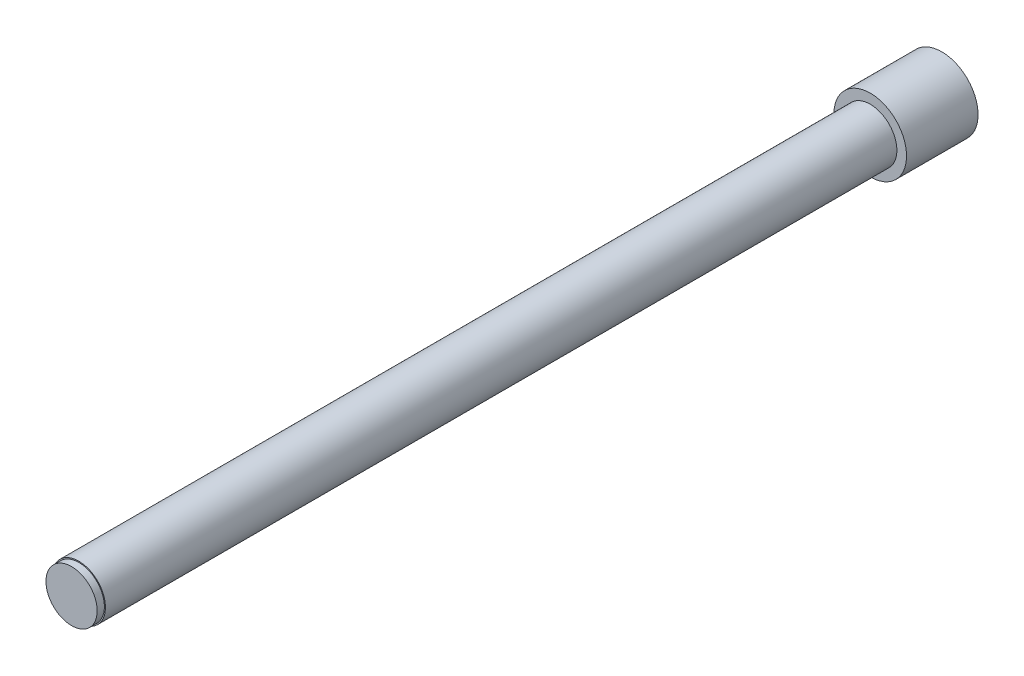
ISO-10303-21;
HEADER;
FILE_DESCRIPTION(('STEP AP214'),'2;1');
FILE_NAME('part.step','',(''),(''),'','','');
FILE_SCHEMA(('AUTOMOTIVE_DESIGN { 1 0 10303 214 1 1 1 1 }'));
ENDSEC;
DATA;
#1=APPLICATION_CONTEXT('core data for automotive mechanical design processes');
#2=APPLICATION_PROTOCOL_DEFINITION('international standard','automotive_design',2000,#1);
#3=PRODUCT_CONTEXT('',#1,'mechanical');
#4=PRODUCT('Part','Part','',(#3));
#5=PRODUCT_RELATED_PRODUCT_CATEGORY('part','',(#4));
#6=PRODUCT_DEFINITION_FORMATION('','',#4);
#7=PRODUCT_DEFINITION_CONTEXT('part definition',#1,'design');
#8=PRODUCT_DEFINITION('design','',#6,#7);
#9=PRODUCT_DEFINITION_SHAPE('','',#8);
#10=(LENGTH_UNIT() NAMED_UNIT(*) SI_UNIT(.MILLI.,.METRE.));
#11=(NAMED_UNIT(*) PLANE_ANGLE_UNIT() SI_UNIT($,.RADIAN.));
#12=(NAMED_UNIT(*) SI_UNIT($,.STERADIAN.) SOLID_ANGLE_UNIT());
#13=UNCERTAINTY_MEASURE_WITH_UNIT(LENGTH_MEASURE(1.E-05),#10,'distance_accuracy_value','');
#14=(GEOMETRIC_REPRESENTATION_CONTEXT(3) GLOBAL_UNCERTAINTY_ASSIGNED_CONTEXT((#13)) GLOBAL_UNIT_ASSIGNED_CONTEXT((#10,
#11,#12)) REPRESENTATION_CONTEXT('',''));
#15=CARTESIAN_POINT('',(0.,0.,0.));
#16=DIRECTION('',(0.,0.,1.));
#17=DIRECTION('',(1.,0.,0.));
#18=AXIS2_PLACEMENT_3D('',#15,#16,#17);
#19=CARTESIAN_POINT('',(0.,0.,40.767));
#20=DIRECTION('',(0.,0.,-1.));
#21=DIRECTION('',(-1.,0.,0.));
#22=AXIS2_PLACEMENT_3D('',#19,#20,#21);
#23=CYLINDRICAL_SURFACE('',#22,2.5);
#24=CARTESIAN_POINT('',(0.,0.,40.0911439523214));
#25=DIRECTION('',(0.,0.,1.));
#26=DIRECTION('',(1.,0.,0.));
#27=AXIS2_PLACEMENT_3D('',#24,#25,#26);
#28=CIRCLE('',#27,2.5);
#29=CARTESIAN_POINT('',(-2.5,0.,40.0911439523214));
#30=VERTEX_POINT('',#29);
#31=EDGE_CURVE('E44',#30,#30,#28,.T.);
#32=CARTESIAN_POINT('',(0.,0.,-34.0651225986248));
#33=DIRECTION('',(0.,0.,-1.));
#34=DIRECTION('',(-1.,0.,0.));
#35=AXIS2_PLACEMENT_3D('',#32,#33,#34);
#36=CIRCLE('',#35,2.5);
#37=CARTESIAN_POINT('',(-2.5,0.,-34.0651225986248));
#38=VERTEX_POINT('',#37);
#39=EDGE_CURVE('E10',#38,#38,#36,.T.);
#40=CARTESIAN_POINT('',(-2.5,0.,40.0911439523214));
#41=CARTESIAN_POINT('',(-2.5,0.,39.3186828424157));
#42=CARTESIAN_POINT('',(-2.5,0.,38.54622173251));
#43=CARTESIAN_POINT('',(-2.5,0.,37.0012995126987));
#44=CARTESIAN_POINT('',(-2.5,0.,36.228838402793));
#45=CARTESIAN_POINT('',(-2.5,0.,34.6839161829816));
#46=CARTESIAN_POINT('',(-2.5,0.,33.9114550730759));
#47=CARTESIAN_POINT('',(-2.5,0.,32.3665328532645));
#48=CARTESIAN_POINT('',(-2.5,0.,31.5940717433588));
#49=CARTESIAN_POINT('',(-2.5,0.,30.0491495235474));
#50=CARTESIAN_POINT('',(-2.5,0.,29.2766884136418));
#51=CARTESIAN_POINT('',(-2.5,0.,27.7317661938304));
#52=CARTESIAN_POINT('',(-2.5,0.,26.9593050839247));
#53=CARTESIAN_POINT('',(-2.5,0.,25.4143828641133));
#54=CARTESIAN_POINT('',(-2.5,0.,24.6419217542076));
#55=CARTESIAN_POINT('',(-2.5,0.,23.0969995343962));
#56=CARTESIAN_POINT('',(-2.5,0.,22.3245384244905));
#57=CARTESIAN_POINT('',(-2.5,0.,20.7796162046792));
#58=CARTESIAN_POINT('',(-2.5,0.,20.0071550947735));
#59=CARTESIAN_POINT('',(-2.5,0.,18.4622328749621));
#60=CARTESIAN_POINT('',(-2.5,0.,17.6897717650564));
#61=CARTESIAN_POINT('',(-2.5,0.,16.144849545245));
#62=CARTESIAN_POINT('',(-2.5,0.,15.3723884353393));
#63=CARTESIAN_POINT('',(-2.5,0.,13.827466215528));
#64=CARTESIAN_POINT('',(-2.5,0.,13.0550051056223));
#65=CARTESIAN_POINT('',(-2.5,0.,11.5100828858109));
#66=CARTESIAN_POINT('',(-2.5,0.,10.7376217759052));
#67=CARTESIAN_POINT('',(-2.5,0.,9.19269955609382));
#68=CARTESIAN_POINT('',(-2.5,0.,8.42023844618813));
#69=CARTESIAN_POINT('',(-2.5,0.,6.87531622637675));
#70=CARTESIAN_POINT('',(-2.5,0.,6.10285511647106));
#71=CARTESIAN_POINT('',(-2.5,0.,4.55793289665968));
#72=CARTESIAN_POINT('',(-2.5,0.,3.78547178675399));
#73=CARTESIAN_POINT('',(-2.5,0.,2.24054956694261));
#74=CARTESIAN_POINT('',(-2.5,0.,1.46808845703692));
#75=CARTESIAN_POINT('',(-2.5,0.,-0.0768337627744577));
#76=CARTESIAN_POINT('',(-2.5,0.,-0.849294872680146));
#77=CARTESIAN_POINT('',(-2.5,0.,-2.39421709249153));
#78=CARTESIAN_POINT('',(-2.5,0.,-3.16667820239722));
#79=CARTESIAN_POINT('',(-2.5,0.,-4.71160042220859));
#80=CARTESIAN_POINT('',(-2.5,0.,-5.48406153211428));
#81=CARTESIAN_POINT('',(-2.5,0.,-7.02898375192566));
#82=CARTESIAN_POINT('',(-2.5,0.,-7.80144486183135));
#83=CARTESIAN_POINT('',(-2.5,0.,-9.34636708164273));
#84=CARTESIAN_POINT('',(-2.5,0.,-10.1188281915484));
#85=CARTESIAN_POINT('',(-2.5,0.,-11.6637504113598));
#86=CARTESIAN_POINT('',(-2.5,0.,-12.4362115212655));
#87=CARTESIAN_POINT('',(-2.5,0.,-13.9811337410769));
#88=CARTESIAN_POINT('',(-2.5,0.,-14.7535948509826));
#89=CARTESIAN_POINT('',(-2.5,0.,-16.2985170707939));
#90=CARTESIAN_POINT('',(-2.5,0.,-17.0709781806996));
#91=CARTESIAN_POINT('',(-2.5,0.,-18.615900400511));
#92=CARTESIAN_POINT('',(-2.5,0.,-19.3883615104167));
#93=CARTESIAN_POINT('',(-2.5,0.,-20.9332837302281));
#94=CARTESIAN_POINT('',(-2.5,0.,-21.7057448401338));
#95=CARTESIAN_POINT('',(-2.5,0.,-23.2506670599451));
#96=CARTESIAN_POINT('',(-2.5,0.,-24.0231281698508));
#97=CARTESIAN_POINT('',(-2.5,0.,-25.5680503896622));
#98=CARTESIAN_POINT('',(-2.5,0.,-26.3405114995679));
#99=CARTESIAN_POINT('',(-2.5,0.,-27.8854337193793));
#100=CARTESIAN_POINT('',(-2.5,0.,-28.657894829285));
#101=CARTESIAN_POINT('',(-2.5,0.,-30.2028170490963));
#102=CARTESIAN_POINT('',(-2.5,0.,-30.975278159002));
#103=CARTESIAN_POINT('',(-2.5,0.,-32.5202003788134));
#104=CARTESIAN_POINT('',(-2.5,0.,-33.2926614887191));
#105=CARTESIAN_POINT('',(-2.5,0.,-34.0651225986248));
#106=B_SPLINE_CURVE_WITH_KNOTS('',3,(#40,#41,#42,#43,#44,#45,#46,#47,#48,#49,#50,#51,#52,#53,
#54,#55,#56,#57,#58,#59,#60,#61,#62,#63,#64,#65,#66,#67,#68,#69,#70,#71,#72,#73,#74,#75,#76,#77,
#78,#79,#80,#81,#82,#83,#84,#85,#86,#87,#88,#89,#90,#91,#92,#93,#94,#95,#96,#97,#98,#99,#100,
#101,#102,#103,#104,#105),.UNSPECIFIED.,.F.,.F.,(4,2,2,2,2,2,2,2,2,2,2,2,2,2,2,2,2,2,2,2,2,2,2,
2,2,2,2,2,2,2,2,2,4),(0.,2.31738332971707,4.63476665943414,6.9521499891512,9.26953331886827,
11.5869166485853,13.9042999783024,16.2216833080195,18.5390666377365,20.8564499674536,
23.1738332971707,25.4912166268878,27.8085999566048,30.1259832863219,32.443366616039,
34.760749945756,37.0781332754731,39.3955166051902,41.7128999349072,44.0302832646243,
46.3476665943414,48.6650499240585,50.9824332537755,53.2998165834926,55.6171999132097,
57.9345832429267,60.2519665726438,62.5693499023608,64.8867332320779,67.204116561795,
69.5214998915121,71.8388832212291,74.1562665509462),.UNSPECIFIED.);
#107=EDGE_CURVE('BSEAM30',#30,#38,#106,.T.);
#108=ORIENTED_EDGE('',*,*,#31,.F.);
#109=ORIENTED_EDGE('',*,*,#39,.F.);
#110=ORIENTED_EDGE('',*,*,#107,.T.);
#111=ORIENTED_EDGE('',*,*,#107,.F.);
#112=EDGE_LOOP('',(#108,#110,#109,#111));
#113=FACE_BOUND('',#112,.T.);
#114=ADVANCED_FACE('F30',(#113),#23,.T.);
#115=CARTESIAN_POINT('',(0.,0.,40.767));
#116=DIRECTION('',(0.,0.,1.));
#117=DIRECTION('',(1.,0.,0.));
#118=AXIS2_PLACEMENT_3D('',#115,#116,#117);
#119=CYLINDRICAL_SURFACE('',#118,2.4);
#120=CARTESIAN_POINT('',(0.,0.,40.767));
#121=DIRECTION('',(0.,0.,1.));
#122=DIRECTION('',(1.,0.,0.));
#123=AXIS2_PLACEMENT_3D('',#120,#121,#122);
#124=CIRCLE('',#123,2.4);
#125=CARTESIAN_POINT('',(2.4,0.,40.767));
#126=VERTEX_POINT('',#125);
#127=EDGE_CURVE('E36',#126,#126,#124,.T.);
#128=ORIENTED_EDGE('',*,*,#127,.F.);
#129=EDGE_LOOP('',(#128));
#130=FACE_BOUND('',#129,.T.);
#131=CARTESIAN_POINT('',(0.,0.,40.0911439523214));
#132=DIRECTION('',(0.,0.,1.));
#133=DIRECTION('',(1.,0.,0.));
#134=AXIS2_PLACEMENT_3D('',#131,#132,#133);
#135=CIRCLE('',#134,2.4);
#136=CARTESIAN_POINT('',(2.4,0.,40.0911439523214));
#137=VERTEX_POINT('',#136);
#138=EDGE_CURVE('E40',#137,#137,#135,.T.);
#139=ORIENTED_EDGE('',*,*,#138,.T.);
#140=EDGE_LOOP('',(#139));
#141=FACE_BOUND('',#140,.T.);
#142=ADVANCED_FACE('F74',(#130,#141),#119,.T.);
#143=CARTESIAN_POINT('',(0.,2.5,40.0911439523214));
#144=DIRECTION('',(0.,0.,1.));
#145=DIRECTION('',(1.,0.,0.));
#146=AXIS2_PLACEMENT_3D('',#143,#144,#145);
#147=PLANE('',#146);
#148=ORIENTED_EDGE('',*,*,#31,.T.);
#149=EDGE_LOOP('',(#148));
#150=FACE_BOUND('',#149,.T.);
#151=ORIENTED_EDGE('',*,*,#138,.F.);
#152=EDGE_LOOP('',(#151));
#153=FACE_BOUND('',#152,.T.);
#154=ADVANCED_FACE('F69',(#150,#153),#147,.T.);
#155=CARTESIAN_POINT('',(0.,0.,40.767));
#156=DIRECTION('',(0.,0.,1.));
#157=DIRECTION('',(1.,0.,0.));
#158=AXIS2_PLACEMENT_3D('',#155,#156,#157);
#159=PLANE('',#158);
#160=ORIENTED_EDGE('',*,*,#127,.T.);
#161=EDGE_LOOP('',(#160));
#162=FACE_BOUND('',#161,.T.);
#163=ADVANCED_FACE('F61',(#162),#159,.T.);
#164=CARTESIAN_POINT('',(0.,0.,-24.4421751514152));
#165=DIRECTION('',(0.,0.,-1.));
#166=DIRECTION('',(-1.,0.,0.));
#167=AXIS2_PLACEMENT_3D('',#164,#165,#166);
#168=CYLINDRICAL_SURFACE('',#167,3.40222569746185);
#169=CARTESIAN_POINT('',(0.,0.,-34.0651225986248));
#170=DIRECTION('',(0.,0.,-1.));
#171=DIRECTION('',(-1.,0.,0.));
#172=AXIS2_PLACEMENT_3D('',#169,#170,#171);
#173=CIRCLE('',#172,3.40222569746185);
#174=CARTESIAN_POINT('',(-3.40222569746185,0.,-34.0651225986248));
#175=VERTEX_POINT('',#174);
#176=EDGE_CURVE('E49',#175,#175,#173,.F.);
#177=ORIENTED_EDGE('',*,*,#176,.F.);
#178=EDGE_LOOP('',(#177));
#179=FACE_BOUND('',#178,.T.);
#180=CARTESIAN_POINT('',(0.,0.,-40.767));
#181=DIRECTION('',(0.,0.,-1.));
#182=DIRECTION('',(-1.,0.,0.));
#183=AXIS2_PLACEMENT_3D('',#180,#181,#182);
#184=CIRCLE('',#183,3.40222569746185);
#185=CARTESIAN_POINT('',(-3.40222569746185,0.,-40.767));
#186=VERTEX_POINT('',#185);
#187=EDGE_CURVE('E52',#186,#186,#184,.T.);
#188=ORIENTED_EDGE('',*,*,#187,.F.);
#189=EDGE_LOOP('',(#188));
#190=FACE_BOUND('',#189,.T.);
#191=ADVANCED_FACE('F58',(#179,#190),#168,.T.);
#192=CARTESIAN_POINT('',(0.,0.,-34.0651225986248));
#193=DIRECTION('',(0.,0.,-1.));
#194=DIRECTION('',(-0.0700376079387779,-0.997544351632655,0.));
#195=AXIS2_PLACEMENT_3D('',#192,#193,#194);
#196=PLANE('',#195);
#197=ORIENTED_EDGE('',*,*,#39,.T.);
#198=EDGE_LOOP('',(#197));
#199=FACE_BOUND('',#198,.T.);
#200=ORIENTED_EDGE('',*,*,#176,.T.);
#201=EDGE_LOOP('',(#200));
#202=FACE_BOUND('',#201,.T.);
#203=ADVANCED_FACE('F60',(#199,#202),#196,.F.);
#204=CARTESIAN_POINT('',(0.,0.,-40.767));
#205=DIRECTION('',(0.,0.,1.));
#206=DIRECTION('',(1.,0.,0.));
#207=AXIS2_PLACEMENT_3D('',#204,#205,#206);
#208=PLANE('',#207);
#209=ORIENTED_EDGE('',*,*,#187,.T.);
#210=EDGE_LOOP('',(#209));
#211=FACE_BOUND('',#210,.T.);
#212=ADVANCED_FACE('F56',(#211),#208,.F.);
#213=CLOSED_SHELL('',(#114,#142,#154,#163,#191,#203,#212));
#214=MANIFOLD_SOLID_BREP('B2',#213);
#215=ADVANCED_BREP_SHAPE_REPRESENTATION('',(#18,#214),#14);
#216=SHAPE_DEFINITION_REPRESENTATION(#9,#215);
ENDSEC;
END-ISO-10303-21;
